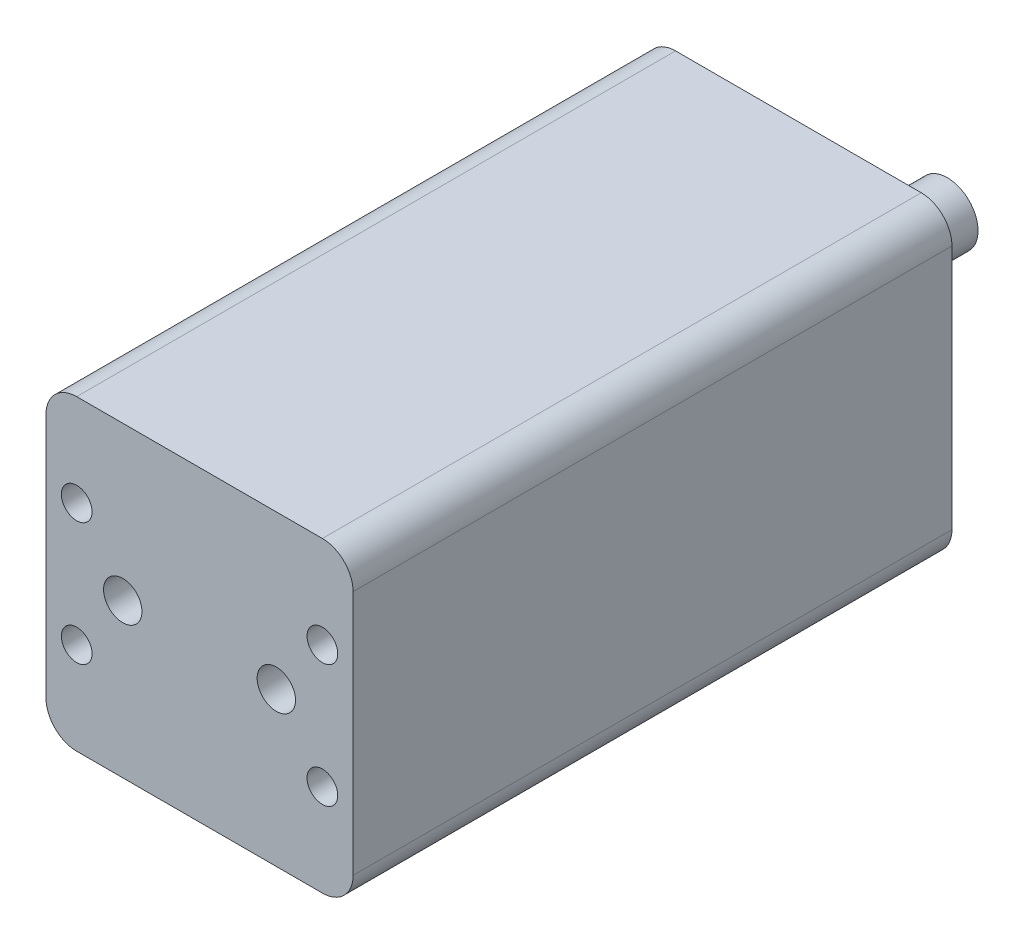
ISO-10303-21;
HEADER;
FILE_DESCRIPTION(('STEP AP214'),'2;1');
FILE_NAME('part.step','',(''),(''),'','','');
FILE_SCHEMA(('AUTOMOTIVE_DESIGN { 1 0 10303 214 1 1 1 1 }'));
ENDSEC;
DATA;
#1=APPLICATION_CONTEXT('core data for automotive mechanical design processes');
#2=APPLICATION_PROTOCOL_DEFINITION('international standard','automotive_design',2000,#1);
#3=PRODUCT_CONTEXT('',#1,'mechanical');
#4=PRODUCT('Part','Part','',(#3));
#5=PRODUCT_RELATED_PRODUCT_CATEGORY('part','',(#4));
#6=PRODUCT_DEFINITION_FORMATION('','',#4);
#7=PRODUCT_DEFINITION_CONTEXT('part definition',#1,'design');
#8=PRODUCT_DEFINITION('design','',#6,#7);
#9=PRODUCT_DEFINITION_SHAPE('','',#8);
#10=(LENGTH_UNIT() NAMED_UNIT(*) SI_UNIT(.MILLI.,.METRE.));
#11=(NAMED_UNIT(*) PLANE_ANGLE_UNIT() SI_UNIT($,.RADIAN.));
#12=(NAMED_UNIT(*) SI_UNIT($,.STERADIAN.) SOLID_ANGLE_UNIT());
#13=UNCERTAINTY_MEASURE_WITH_UNIT(LENGTH_MEASURE(1.E-05),#10,'distance_accuracy_value','');
#14=(GEOMETRIC_REPRESENTATION_CONTEXT(3) GLOBAL_UNCERTAINTY_ASSIGNED_CONTEXT((#13)) GLOBAL_UNIT_ASSIGNED_CONTEXT((#10,
#11,#12)) REPRESENTATION_CONTEXT('',''));
#15=CARTESIAN_POINT('',(0.,0.,0.));
#16=DIRECTION('',(0.,0.,1.));
#17=DIRECTION('',(1.,0.,0.));
#18=AXIS2_PLACEMENT_3D('',#15,#16,#17);
#19=CARTESIAN_POINT('',(-16.,-16.,78.));
#20=DIRECTION('',(0.,0.,-1.));
#21=DIRECTION('',(-1.,0.,0.));
#22=AXIS2_PLACEMENT_3D('',#19,#20,#21);
#23=CYLINDRICAL_SURFACE('',#22,4.);
#24=CARTESIAN_POINT('',(-16.,-16.,0.));
#25=DIRECTION('',(0.,0.,1.));
#26=DIRECTION('',(-1.,0.,0.));
#27=AXIS2_PLACEMENT_3D('',#24,#25,#26);
#28=CIRCLE('',#27,4.);
#29=CARTESIAN_POINT('',(-20.,-16.,0.));
#30=VERTEX_POINT('',#29);
#31=CARTESIAN_POINT('',(-16.,-20.,0.));
#32=VERTEX_POINT('',#31);
#33=EDGE_CURVE('E149',#30,#32,#28,.T.);
#34=ORIENTED_EDGE('',*,*,#33,.T.);
#35=DIRECTION('',(0.,0.,-1.));
#36=VECTOR('',#35,1.);
#37=CARTESIAN_POINT('',(-16.,-20.,78.));
#38=LINE('',#37,#36);
#39=CARTESIAN_POINT('',(-16.,-20.,78.));
#40=VERTEX_POINT('',#39);
#41=EDGE_CURVE('E48',#40,#32,#38,.T.);
#42=ORIENTED_EDGE('',*,*,#41,.F.);
#43=CARTESIAN_POINT('',(-16.,-16.,78.));
#44=DIRECTION('',(0.,0.,1.));
#45=DIRECTION('',(-1.,0.,0.));
#46=AXIS2_PLACEMENT_3D('',#43,#44,#45);
#47=CIRCLE('',#46,4.);
#48=CARTESIAN_POINT('',(-20.,-16.,78.));
#49=VERTEX_POINT('',#48);
#50=EDGE_CURVE('E172',#49,#40,#47,.T.);
#51=ORIENTED_EDGE('',*,*,#50,.F.);
#52=DIRECTION('',(0.,0.,-1.));
#53=VECTOR('',#52,1.);
#54=CARTESIAN_POINT('',(-20.,-16.,78.));
#55=LINE('',#54,#53);
#56=EDGE_CURVE('E145',#49,#30,#55,.T.);
#57=ORIENTED_EDGE('',*,*,#56,.T.);
#58=EDGE_LOOP('',(#34,#42,#51,#57));
#59=FACE_BOUND('',#58,.T.);
#60=ADVANCED_FACE('F45',(#59),#23,.T.);
#61=CARTESIAN_POINT('',(-16.,-20.,78.));
#62=DIRECTION('',(0.,1.,0.));
#63=DIRECTION('',(0.,0.,1.));
#64=AXIS2_PLACEMENT_3D('',#61,#62,#63);
#65=PLANE('',#64);
#66=DIRECTION('',(1.,0.,0.));
#67=VECTOR('',#66,1.);
#68=CARTESIAN_POINT('',(-16.,-20.,0.));
#69=LINE('',#68,#67);
#70=CARTESIAN_POINT('',(16.,-20.,0.));
#71=VERTEX_POINT('',#70);
#72=EDGE_CURVE('E153',#32,#71,#69,.T.);
#73=ORIENTED_EDGE('',*,*,#72,.T.);
#74=DIRECTION('',(0.,0.,-1.));
#75=VECTOR('',#74,1.);
#76=CARTESIAN_POINT('',(16.,-20.,78.));
#77=LINE('',#76,#75);
#78=CARTESIAN_POINT('',(16.,-20.,78.));
#79=VERTEX_POINT('',#78);
#80=EDGE_CURVE('E186',#79,#71,#77,.T.);
#81=ORIENTED_EDGE('',*,*,#80,.F.);
#82=DIRECTION('',(1.,0.,0.));
#83=VECTOR('',#82,1.);
#84=CARTESIAN_POINT('',(-16.,-20.,78.));
#85=LINE('',#84,#83);
#86=EDGE_CURVE('E108',#40,#79,#85,.T.);
#87=ORIENTED_EDGE('',*,*,#86,.F.);
#88=ORIENTED_EDGE('',*,*,#41,.T.);
#89=EDGE_LOOP('',(#73,#81,#87,#88));
#90=FACE_BOUND('',#89,.T.);
#91=ADVANCED_FACE('F341',(#90),#65,.F.);
#92=CARTESIAN_POINT('',(16.,-16.,78.));
#93=DIRECTION('',(0.,0.,-1.));
#94=DIRECTION('',(-1.,0.,0.));
#95=AXIS2_PLACEMENT_3D('',#92,#93,#94);
#96=CYLINDRICAL_SURFACE('',#95,4.);
#97=CARTESIAN_POINT('',(16.,-16.,0.));
#98=DIRECTION('',(0.,0.,1.));
#99=DIRECTION('',(1.,0.,0.));
#100=AXIS2_PLACEMENT_3D('',#97,#98,#99);
#101=CIRCLE('',#100,4.);
#102=CARTESIAN_POINT('',(20.,-16.,0.));
#103=VERTEX_POINT('',#102);
#104=EDGE_CURVE('E157',#71,#103,#101,.T.);
#105=ORIENTED_EDGE('',*,*,#104,.T.);
#106=DIRECTION('',(0.,0.,-1.));
#107=VECTOR('',#106,1.);
#108=CARTESIAN_POINT('',(20.,-16.,78.));
#109=LINE('',#108,#107);
#110=CARTESIAN_POINT('',(20.,-16.,78.));
#111=VERTEX_POINT('',#110);
#112=EDGE_CURVE('E183',#111,#103,#109,.T.);
#113=ORIENTED_EDGE('',*,*,#112,.F.);
#114=CARTESIAN_POINT('',(16.,-16.,78.));
#115=DIRECTION('',(0.,0.,1.));
#116=DIRECTION('',(1.,0.,0.));
#117=AXIS2_PLACEMENT_3D('',#114,#115,#116);
#118=CIRCLE('',#117,4.);
#119=EDGE_CURVE('E205',#79,#111,#118,.T.);
#120=ORIENTED_EDGE('',*,*,#119,.F.);
#121=ORIENTED_EDGE('',*,*,#80,.T.);
#122=EDGE_LOOP('',(#105,#113,#120,#121));
#123=FACE_BOUND('',#122,.T.);
#124=ADVANCED_FACE('F346',(#123),#96,.T.);
#125=CARTESIAN_POINT('',(20.,-16.,78.));
#126=DIRECTION('',(-1.,0.,0.));
#127=DIRECTION('',(0.,0.,1.));
#128=AXIS2_PLACEMENT_3D('',#125,#126,#127);
#129=PLANE('',#128);
#130=DIRECTION('',(0.,1.,0.));
#131=VECTOR('',#130,1.);
#132=CARTESIAN_POINT('',(20.,-16.,0.));
#133=LINE('',#132,#131);
#134=CARTESIAN_POINT('',(20.,16.,0.));
#135=VERTEX_POINT('',#134);
#136=EDGE_CURVE('E160',#103,#135,#133,.T.);
#137=ORIENTED_EDGE('',*,*,#136,.T.);
#138=DIRECTION('',(0.,0.,-1.));
#139=VECTOR('',#138,1.);
#140=CARTESIAN_POINT('',(20.,16.,78.));
#141=LINE('',#140,#139);
#142=CARTESIAN_POINT('',(20.,16.,78.));
#143=VERTEX_POINT('',#142);
#144=EDGE_CURVE('E179',#143,#135,#141,.T.);
#145=ORIENTED_EDGE('',*,*,#144,.F.);
#146=DIRECTION('',(0.,1.,0.));
#147=VECTOR('',#146,1.);
#148=CARTESIAN_POINT('',(20.,-16.,78.));
#149=LINE('',#148,#147);
#150=EDGE_CURVE('E208',#111,#143,#149,.T.);
#151=ORIENTED_EDGE('',*,*,#150,.F.);
#152=ORIENTED_EDGE('',*,*,#112,.T.);
#153=EDGE_LOOP('',(#137,#145,#151,#152));
#154=FACE_BOUND('',#153,.T.);
#155=ADVANCED_FACE('F355',(#154),#129,.F.);
#156=CARTESIAN_POINT('',(16.,16.,78.));
#157=DIRECTION('',(0.,0.,-1.));
#158=DIRECTION('',(-1.,0.,0.));
#159=AXIS2_PLACEMENT_3D('',#156,#157,#158);
#160=CYLINDRICAL_SURFACE('',#159,4.);
#161=CARTESIAN_POINT('',(16.,16.,0.));
#162=DIRECTION('',(0.,0.,1.));
#163=DIRECTION('',(-1.,0.,0.));
#164=AXIS2_PLACEMENT_3D('',#161,#162,#163);
#165=CIRCLE('',#164,4.);
#166=CARTESIAN_POINT('',(16.,20.,0.));
#167=VERTEX_POINT('',#166);
#168=EDGE_CURVE('E163',#135,#167,#165,.T.);
#169=ORIENTED_EDGE('',*,*,#168,.T.);
#170=DIRECTION('',(0.,0.,-1.));
#171=VECTOR('',#170,1.);
#172=CARTESIAN_POINT('',(16.,20.,78.));
#173=LINE('',#172,#171);
#174=CARTESIAN_POINT('',(16.,20.,78.));
#175=VERTEX_POINT('',#174);
#176=EDGE_CURVE('E138',#175,#167,#173,.T.);
#177=ORIENTED_EDGE('',*,*,#176,.F.);
#178=CARTESIAN_POINT('',(16.,16.,78.));
#179=DIRECTION('',(0.,0.,1.));
#180=DIRECTION('',(-1.,0.,0.));
#181=AXIS2_PLACEMENT_3D('',#178,#179,#180);
#182=CIRCLE('',#181,4.);
#183=EDGE_CURVE('E127',#143,#175,#182,.T.);
#184=ORIENTED_EDGE('',*,*,#183,.F.);
#185=ORIENTED_EDGE('',*,*,#144,.T.);
#186=EDGE_LOOP('',(#169,#177,#184,#185));
#187=FACE_BOUND('',#186,.T.);
#188=ADVANCED_FACE('F358',(#187),#160,.T.);
#189=CARTESIAN_POINT('',(-16.,20.,78.));
#190=DIRECTION('',(0.,-1.,0.));
#191=DIRECTION('',(0.,0.,-1.));
#192=AXIS2_PLACEMENT_3D('',#189,#190,#191);
#193=PLANE('',#192);
#194=DIRECTION('',(-1.,0.,0.));
#195=VECTOR('',#194,1.);
#196=CARTESIAN_POINT('',(-16.,20.,0.));
#197=LINE('',#196,#195);
#198=CARTESIAN_POINT('',(-16.,20.,0.));
#199=VERTEX_POINT('',#198);
#200=EDGE_CURVE('E136',#167,#199,#197,.T.);
#201=ORIENTED_EDGE('',*,*,#200,.T.);
#202=DIRECTION('',(0.,0.,-1.));
#203=VECTOR('',#202,1.);
#204=CARTESIAN_POINT('',(-16.,20.,78.));
#205=LINE('',#204,#203);
#206=CARTESIAN_POINT('',(-16.,20.,78.));
#207=VERTEX_POINT('',#206);
#208=EDGE_CURVE('E133',#207,#199,#205,.T.);
#209=ORIENTED_EDGE('',*,*,#208,.F.);
#210=DIRECTION('',(-1.,0.,0.));
#211=VECTOR('',#210,1.);
#212=CARTESIAN_POINT('',(-16.,20.,78.));
#213=LINE('',#212,#211);
#214=EDGE_CURVE('E121',#175,#207,#213,.T.);
#215=ORIENTED_EDGE('',*,*,#214,.F.);
#216=ORIENTED_EDGE('',*,*,#176,.T.);
#217=EDGE_LOOP('',(#201,#209,#215,#216));
#218=FACE_BOUND('',#217,.T.);
#219=ADVANCED_FACE('F134',(#218),#193,.F.);
#220=CARTESIAN_POINT('',(-16.,16.,78.));
#221=DIRECTION('',(0.,0.,-1.));
#222=DIRECTION('',(-1.,0.,0.));
#223=AXIS2_PLACEMENT_3D('',#220,#221,#222);
#224=CYLINDRICAL_SURFACE('',#223,4.);
#225=CARTESIAN_POINT('',(-16.,16.,0.));
#226=DIRECTION('',(0.,0.,1.));
#227=DIRECTION('',(-1.,0.,0.));
#228=AXIS2_PLACEMENT_3D('',#225,#226,#227);
#229=CIRCLE('',#228,4.);
#230=CARTESIAN_POINT('',(-20.,16.,0.));
#231=VERTEX_POINT('',#230);
#232=EDGE_CURVE('E93',#199,#231,#229,.T.);
#233=ORIENTED_EDGE('',*,*,#232,.T.);
#234=DIRECTION('',(0.,0.,-1.));
#235=VECTOR('',#234,1.);
#236=CARTESIAN_POINT('',(-20.,16.,78.));
#237=LINE('',#236,#235);
#238=CARTESIAN_POINT('',(-20.,16.,78.));
#239=VERTEX_POINT('',#238);
#240=EDGE_CURVE('E139',#239,#231,#237,.T.);
#241=ORIENTED_EDGE('',*,*,#240,.F.);
#242=CARTESIAN_POINT('',(-16.,16.,78.));
#243=DIRECTION('',(0.,0.,1.));
#244=DIRECTION('',(-1.,0.,0.));
#245=AXIS2_PLACEMENT_3D('',#242,#243,#244);
#246=CIRCLE('',#245,4.);
#247=EDGE_CURVE('E125',#207,#239,#246,.T.);
#248=ORIENTED_EDGE('',*,*,#247,.F.);
#249=ORIENTED_EDGE('',*,*,#208,.T.);
#250=EDGE_LOOP('',(#233,#241,#248,#249));
#251=FACE_BOUND('',#250,.T.);
#252=ADVANCED_FACE('F141',(#251),#224,.T.);
#253=CARTESIAN_POINT('',(-20.,-16.,78.));
#254=DIRECTION('',(1.,0.,0.));
#255=DIRECTION('',(0.,0.,-1.));
#256=AXIS2_PLACEMENT_3D('',#253,#254,#255);
#257=PLANE('',#256);
#258=DIRECTION('',(0.,-1.,0.));
#259=VECTOR('',#258,1.);
#260=CARTESIAN_POINT('',(-20.,-16.,0.));
#261=LINE('',#260,#259);
#262=EDGE_CURVE('E99',#231,#30,#261,.T.);
#263=ORIENTED_EDGE('',*,*,#262,.T.);
#264=ORIENTED_EDGE('',*,*,#56,.F.);
#265=DIRECTION('',(0.,-1.,0.));
#266=VECTOR('',#265,1.);
#267=CARTESIAN_POINT('',(-20.,-16.,78.));
#268=LINE('',#267,#266);
#269=EDGE_CURVE('E64',#239,#49,#268,.T.);
#270=ORIENTED_EDGE('',*,*,#269,.F.);
#271=ORIENTED_EDGE('',*,*,#240,.T.);
#272=EDGE_LOOP('',(#263,#264,#270,#271));
#273=FACE_BOUND('',#272,.T.);
#274=ADVANCED_FACE('F311',(#273),#257,.F.);
#275=CARTESIAN_POINT('',(-16.,-16.,78.));
#276=DIRECTION('',(0.,0.,-1.));
#277=DIRECTION('',(-1.,0.,0.));
#278=AXIS2_PLACEMENT_3D('',#275,#276,#277);
#279=PLANE('',#278);
#280=CARTESIAN_POINT('',(10.,0.,78.));
#281=DIRECTION('',(0.,0.,1.));
#282=DIRECTION('',(1.,0.,0.));
#283=AXIS2_PLACEMENT_3D('',#280,#281,#282);
#284=CIRCLE('',#283,2.5);
#285=CARTESIAN_POINT('',(12.5,0.,78.));
#286=VERTEX_POINT('',#285);
#287=EDGE_CURVE('E285',#286,#286,#284,.T.);
#288=ORIENTED_EDGE('',*,*,#287,.F.);
#289=EDGE_LOOP('',(#288));
#290=FACE_BOUND('',#289,.T.);
#291=CARTESIAN_POINT('',(-10.,0.,78.));
#292=DIRECTION('',(0.,0.,1.));
#293=DIRECTION('',(-1.,0.,0.));
#294=AXIS2_PLACEMENT_3D('',#291,#292,#293);
#295=CIRCLE('',#294,2.5);
#296=CARTESIAN_POINT('',(-12.5,0.,78.));
#297=VERTEX_POINT('',#296);
#298=EDGE_CURVE('E289',#297,#297,#295,.T.);
#299=ORIENTED_EDGE('',*,*,#298,.F.);
#300=EDGE_LOOP('',(#299));
#301=FACE_BOUND('',#300,.T.);
#302=CARTESIAN_POINT('',(16.,8.,78.));
#303=DIRECTION('',(0.,0.,1.));
#304=DIRECTION('',(-1.,0.,0.));
#305=AXIS2_PLACEMENT_3D('',#302,#303,#304);
#306=CIRCLE('',#305,2.);
#307=CARTESIAN_POINT('',(14.,8.,78.));
#308=VERTEX_POINT('',#307);
#309=EDGE_CURVE('E257',#308,#308,#306,.T.);
#310=ORIENTED_EDGE('',*,*,#309,.F.);
#311=EDGE_LOOP('',(#310));
#312=FACE_BOUND('',#311,.T.);
#313=CARTESIAN_POINT('',(-16.,-8.,78.));
#314=DIRECTION('',(0.,0.,1.));
#315=DIRECTION('',(-1.,0.,0.));
#316=AXIS2_PLACEMENT_3D('',#313,#314,#315);
#317=CIRCLE('',#316,2.);
#318=CARTESIAN_POINT('',(-18.,-8.,78.));
#319=VERTEX_POINT('',#318);
#320=EDGE_CURVE('E265',#319,#319,#317,.T.);
#321=ORIENTED_EDGE('',*,*,#320,.F.);
#322=EDGE_LOOP('',(#321));
#323=FACE_BOUND('',#322,.T.);
#324=CARTESIAN_POINT('',(16.,-7.99999999999999,78.));
#325=DIRECTION('',(0.,0.,1.));
#326=DIRECTION('',(1.,0.,0.));
#327=AXIS2_PLACEMENT_3D('',#324,#325,#326);
#328=CIRCLE('',#327,2.);
#329=CARTESIAN_POINT('',(18.,-7.99999999999999,78.));
#330=VERTEX_POINT('',#329);
#331=EDGE_CURVE('E273',#330,#330,#328,.T.);
#332=ORIENTED_EDGE('',*,*,#331,.F.);
#333=EDGE_LOOP('',(#332));
#334=FACE_BOUND('',#333,.T.);
#335=CARTESIAN_POINT('',(-16.,8.,78.));
#336=DIRECTION('',(0.,0.,1.));
#337=DIRECTION('',(1.,0.,0.));
#338=AXIS2_PLACEMENT_3D('',#335,#336,#337);
#339=CIRCLE('',#338,2.);
#340=CARTESIAN_POINT('',(-14.,8.,78.));
#341=VERTEX_POINT('',#340);
#342=EDGE_CURVE('E253',#341,#341,#339,.T.);
#343=ORIENTED_EDGE('',*,*,#342,.F.);
#344=EDGE_LOOP('',(#343));
#345=FACE_BOUND('',#344,.T.);
#346=ORIENTED_EDGE('',*,*,#50,.T.);
#347=ORIENTED_EDGE('',*,*,#86,.T.);
#348=ORIENTED_EDGE('',*,*,#119,.T.);
#349=ORIENTED_EDGE('',*,*,#150,.T.);
#350=ORIENTED_EDGE('',*,*,#183,.T.);
#351=ORIENTED_EDGE('',*,*,#214,.T.);
#352=ORIENTED_EDGE('',*,*,#247,.T.);
#353=ORIENTED_EDGE('',*,*,#269,.T.);
#354=EDGE_LOOP('',(#346,#347,#348,#349,#350,#351,#352,#353));
#355=FACE_BOUND('',#354,.T.);
#356=ADVANCED_FACE('F123',(#290,#301,#312,#323,#334,#345,#355),#279,.F.);
#357=CARTESIAN_POINT('',(-16.,-16.,0.));
#358=DIRECTION('',(0.,0.,-1.));
#359=DIRECTION('',(-1.,0.,0.));
#360=AXIS2_PLACEMENT_3D('',#357,#358,#359);
#361=PLANE('',#360);
#362=CARTESIAN_POINT('',(15.5000000000002,-15.4999999999998,0.));
#363=DIRECTION('',(0.,0.,-1.));
#364=DIRECTION('',(-1.,0.,0.));
#365=AXIS2_PLACEMENT_3D('',#362,#363,#364);
#366=CIRCLE('',#365,2.);
#367=CARTESIAN_POINT('',(13.5000000000002,-15.4999999999998,0.));
#368=VERTEX_POINT('',#367);
#369=EDGE_CURVE('E241',#368,#368,#366,.T.);
#370=ORIENTED_EDGE('',*,*,#369,.F.);
#371=EDGE_LOOP('',(#370));
#372=FACE_BOUND('',#371,.T.);
#373=CARTESIAN_POINT('',(-15.4999999999999,-15.5000000000001,0.));
#374=DIRECTION('',(0.,0.,-1.));
#375=DIRECTION('',(-1.,0.,0.));
#376=AXIS2_PLACEMENT_3D('',#373,#374,#375);
#377=CIRCLE('',#376,2.);
#378=CARTESIAN_POINT('',(-17.4999999999999,-15.5000000000001,0.));
#379=VERTEX_POINT('',#378);
#380=EDGE_CURVE('E233',#379,#379,#377,.T.);
#381=ORIENTED_EDGE('',*,*,#380,.F.);
#382=EDGE_LOOP('',(#381));
#383=FACE_BOUND('',#382,.T.);
#384=CARTESIAN_POINT('',(-15.5000000000001,15.4999999999999,0.));
#385=DIRECTION('',(0.,0.,-1.));
#386=DIRECTION('',(-1.,0.,0.));
#387=AXIS2_PLACEMENT_3D('',#384,#385,#386);
#388=CIRCLE('',#387,2.);
#389=CARTESIAN_POINT('',(-17.5000000000001,15.4999999999999,0.));
#390=VERTEX_POINT('',#389);
#391=EDGE_CURVE('E225',#390,#390,#388,.T.);
#392=ORIENTED_EDGE('',*,*,#391,.F.);
#393=EDGE_LOOP('',(#392));
#394=FACE_BOUND('',#393,.T.);
#395=CARTESIAN_POINT('',(15.5,15.5,0.));
#396=DIRECTION('',(0.,0.,-1.));
#397=DIRECTION('',(-1.,0.,0.));
#398=AXIS2_PLACEMENT_3D('',#395,#396,#397);
#399=CIRCLE('',#398,2.);
#400=CARTESIAN_POINT('',(13.5,15.5,0.));
#401=VERTEX_POINT('',#400);
#402=EDGE_CURVE('E221',#401,#401,#399,.T.);
#403=ORIENTED_EDGE('',*,*,#402,.F.);
#404=EDGE_LOOP('',(#403));
#405=FACE_BOUND('',#404,.T.);
#406=CARTESIAN_POINT('',(0.,0.,0.));
#407=DIRECTION('',(0.,0.,-1.));
#408=DIRECTION('',(-1.,0.,0.));
#409=AXIS2_PLACEMENT_3D('',#406,#407,#408);
#410=CIRCLE('',#409,16.);
#411=CARTESIAN_POINT('',(-16.,0.,0.));
#412=VERTEX_POINT('',#411);
#413=EDGE_CURVE('E55',#412,#412,#410,.T.);
#414=ORIENTED_EDGE('',*,*,#413,.F.);
#415=EDGE_LOOP('',(#414));
#416=FACE_BOUND('',#415,.T.);
#417=ORIENTED_EDGE('',*,*,#33,.F.);
#418=ORIENTED_EDGE('',*,*,#262,.F.);
#419=ORIENTED_EDGE('',*,*,#232,.F.);
#420=ORIENTED_EDGE('',*,*,#200,.F.);
#421=ORIENTED_EDGE('',*,*,#168,.F.);
#422=ORIENTED_EDGE('',*,*,#136,.F.);
#423=ORIENTED_EDGE('',*,*,#104,.F.);
#424=ORIENTED_EDGE('',*,*,#72,.F.);
#425=EDGE_LOOP('',(#417,#418,#419,#420,#421,#422,#423,#424));
#426=FACE_BOUND('',#425,.T.);
#427=ADVANCED_FACE('F310',(#372,#383,#394,#405,#416,#426),#361,.T.);
#428=CARTESIAN_POINT('',(0.,0.,-3.));
#429=DIRECTION('',(0.,0.,1.));
#430=DIRECTION('',(1.,0.,0.));
#431=AXIS2_PLACEMENT_3D('',#428,#429,#430);
#432=CYLINDRICAL_SURFACE('',#431,16.);
#433=CARTESIAN_POINT('',(0.,0.,-3.));
#434=DIRECTION('',(0.,0.,-1.));
#435=DIRECTION('',(-1.,0.,0.));
#436=AXIS2_PLACEMENT_3D('',#433,#434,#435);
#437=CIRCLE('',#436,16.);
#438=CARTESIAN_POINT('',(-16.,0.,-3.));
#439=VERTEX_POINT('',#438);
#440=EDGE_CURVE('E154',#439,#439,#437,.T.);
#441=ORIENTED_EDGE('',*,*,#440,.F.);
#442=EDGE_LOOP('',(#441));
#443=FACE_BOUND('',#442,.T.);
#444=ORIENTED_EDGE('',*,*,#413,.T.);
#445=EDGE_LOOP('',(#444));
#446=FACE_BOUND('',#445,.T.);
#447=ADVANCED_FACE('F422',(#443,#446),#432,.T.);
#448=CARTESIAN_POINT('',(0.,0.,-3.));
#449=DIRECTION('',(0.,0.,-1.));
#450=DIRECTION('',(-1.,0.,0.));
#451=AXIS2_PLACEMENT_3D('',#448,#449,#450);
#452=PLANE('',#451);
#453=CARTESIAN_POINT('',(0.,0.,-3.));
#454=DIRECTION('',(0.,0.,-1.));
#455=DIRECTION('',(-1.,0.,0.));
#456=AXIS2_PLACEMENT_3D('',#453,#454,#455);
#457=CIRCLE('',#456,4.);
#458=CARTESIAN_POINT('',(-4.,0.,-3.));
#459=VERTEX_POINT('',#458);
#460=EDGE_CURVE('E11',#459,#459,#457,.T.);
#461=ORIENTED_EDGE('',*,*,#460,.F.);
#462=EDGE_LOOP('',(#461));
#463=FACE_BOUND('',#462,.T.);
#464=ORIENTED_EDGE('',*,*,#440,.T.);
#465=EDGE_LOOP('',(#464));
#466=FACE_BOUND('',#465,.T.);
#467=ADVANCED_FACE('F433',(#463,#466),#452,.T.);
#468=CARTESIAN_POINT('',(0.,0.,-19.4));
#469=DIRECTION('',(0.,0.,1.));
#470=DIRECTION('',(1.,0.,0.));
#471=AXIS2_PLACEMENT_3D('',#468,#469,#470);
#472=CYLINDRICAL_SURFACE('',#471,4.);
#473=CARTESIAN_POINT('',(0.,0.,-19.4));
#474=DIRECTION('',(0.,0.,-1.));
#475=DIRECTION('',(-1.,0.,0.));
#476=AXIS2_PLACEMENT_3D('',#473,#474,#475);
#477=CIRCLE('',#476,4.);
#478=CARTESIAN_POINT('',(-4.,0.,-19.4));
#479=VERTEX_POINT('',#478);
#480=EDGE_CURVE('E214',#479,#479,#477,.T.);
#481=ORIENTED_EDGE('',*,*,#480,.F.);
#482=EDGE_LOOP('',(#481));
#483=FACE_BOUND('',#482,.T.);
#484=ORIENTED_EDGE('',*,*,#460,.T.);
#485=EDGE_LOOP('',(#484));
#486=FACE_BOUND('',#485,.T.);
#487=ADVANCED_FACE('F443',(#483,#486),#472,.T.);
#488=CARTESIAN_POINT('',(0.,0.,-19.4));
#489=DIRECTION('',(0.,0.,-1.));
#490=DIRECTION('',(-1.,0.,0.));
#491=AXIS2_PLACEMENT_3D('',#488,#489,#490);
#492=PLANE('',#491);
#493=ORIENTED_EDGE('',*,*,#480,.T.);
#494=EDGE_LOOP('',(#493));
#495=FACE_BOUND('',#494,.T.);
#496=ADVANCED_FACE('F453',(#495),#492,.T.);
#497=CARTESIAN_POINT('',(15.5,15.5,9.));
#498=DIRECTION('',(0.,0.,-1.));
#499=DIRECTION('',(-1.,0.,0.));
#500=AXIS2_PLACEMENT_3D('',#497,#498,#499);
#501=CYLINDRICAL_SURFACE('',#500,2.);
#502=CARTESIAN_POINT('',(15.5,15.5,9.));
#503=DIRECTION('',(0.,0.,-1.));
#504=DIRECTION('',(-1.,0.,0.));
#505=AXIS2_PLACEMENT_3D('',#502,#503,#504);
#506=CIRCLE('',#505,2.);
#507=CARTESIAN_POINT('',(13.5,15.5,9.));
#508=VERTEX_POINT('',#507);
#509=EDGE_CURVE('E217',#508,#508,#506,.T.);
#510=ORIENTED_EDGE('',*,*,#509,.F.);
#511=EDGE_LOOP('',(#510));
#512=FACE_BOUND('',#511,.T.);
#513=ORIENTED_EDGE('',*,*,#402,.T.);
#514=EDGE_LOOP('',(#513));
#515=FACE_BOUND('',#514,.T.);
#516=ADVANCED_FACE('F462',(#512,#515),#501,.F.);
#517=CARTESIAN_POINT('',(15.5,15.5,9.));
#518=DIRECTION('',(0.,0.,-1.));
#519=DIRECTION('',(-1.,0.,0.));
#520=AXIS2_PLACEMENT_3D('',#517,#518,#519);
#521=PLANE('',#520);
#522=ORIENTED_EDGE('',*,*,#509,.T.);
#523=EDGE_LOOP('',(#522));
#524=FACE_BOUND('',#523,.T.);
#525=ADVANCED_FACE('F471',(#524),#521,.T.);
#526=CARTESIAN_POINT('',(-15.5000000000001,15.4999999999999,9.));
#527=DIRECTION('',(0.,0.,-1.));
#528=DIRECTION('',(-1.,0.,0.));
#529=AXIS2_PLACEMENT_3D('',#526,#527,#528);
#530=CYLINDRICAL_SURFACE('',#529,2.);
#531=CARTESIAN_POINT('',(-15.5000000000001,15.4999999999999,9.));
#532=DIRECTION('',(0.,0.,-1.));
#533=DIRECTION('',(-1.,0.,0.));
#534=AXIS2_PLACEMENT_3D('',#531,#532,#533);
#535=CIRCLE('',#534,2.);
#536=CARTESIAN_POINT('',(-17.5000000000001,15.4999999999999,9.));
#537=VERTEX_POINT('',#536);
#538=EDGE_CURVE('E229',#537,#537,#535,.T.);
#539=ORIENTED_EDGE('',*,*,#538,.F.);
#540=EDGE_LOOP('',(#539));
#541=FACE_BOUND('',#540,.T.);
#542=ORIENTED_EDGE('',*,*,#391,.T.);
#543=EDGE_LOOP('',(#542));
#544=FACE_BOUND('',#543,.T.);
#545=ADVANCED_FACE('F481',(#541,#544),#530,.F.);
#546=CARTESIAN_POINT('',(-15.5000000000001,15.4999999999999,9.));
#547=DIRECTION('',(0.,0.,-1.));
#548=DIRECTION('',(-1.,0.,0.));
#549=AXIS2_PLACEMENT_3D('',#546,#547,#548);
#550=PLANE('',#549);
#551=ORIENTED_EDGE('',*,*,#538,.T.);
#552=EDGE_LOOP('',(#551));
#553=FACE_BOUND('',#552,.T.);
#554=ADVANCED_FACE('F491',(#553),#550,.T.);
#555=CARTESIAN_POINT('',(-15.4999999999999,-15.5000000000001,9.));
#556=DIRECTION('',(0.,0.,-1.));
#557=DIRECTION('',(-1.,0.,0.));
#558=AXIS2_PLACEMENT_3D('',#555,#556,#557);
#559=CYLINDRICAL_SURFACE('',#558,2.);
#560=CARTESIAN_POINT('',(-15.4999999999999,-15.5000000000001,9.));
#561=DIRECTION('',(0.,0.,-1.));
#562=DIRECTION('',(-1.,0.,0.));
#563=AXIS2_PLACEMENT_3D('',#560,#561,#562);
#564=CIRCLE('',#563,2.);
#565=CARTESIAN_POINT('',(-17.4999999999999,-15.5000000000001,9.));
#566=VERTEX_POINT('',#565);
#567=EDGE_CURVE('E237',#566,#566,#564,.T.);
#568=ORIENTED_EDGE('',*,*,#567,.F.);
#569=EDGE_LOOP('',(#568));
#570=FACE_BOUND('',#569,.T.);
#571=ORIENTED_EDGE('',*,*,#380,.T.);
#572=EDGE_LOOP('',(#571));
#573=FACE_BOUND('',#572,.T.);
#574=ADVANCED_FACE('F500',(#570,#573),#559,.F.);
#575=CARTESIAN_POINT('',(-15.4999999999999,-15.5000000000001,9.));
#576=DIRECTION('',(0.,0.,-1.));
#577=DIRECTION('',(-1.,0.,0.));
#578=AXIS2_PLACEMENT_3D('',#575,#576,#577);
#579=PLANE('',#578);
#580=ORIENTED_EDGE('',*,*,#567,.T.);
#581=EDGE_LOOP('',(#580));
#582=FACE_BOUND('',#581,.T.);
#583=ADVANCED_FACE('F510',(#582),#579,.T.);
#584=CARTESIAN_POINT('',(15.5000000000002,-15.4999999999998,9.));
#585=DIRECTION('',(0.,0.,-1.));
#586=DIRECTION('',(-1.,0.,0.));
#587=AXIS2_PLACEMENT_3D('',#584,#585,#586);
#588=CYLINDRICAL_SURFACE('',#587,2.);
#589=CARTESIAN_POINT('',(15.5000000000002,-15.4999999999998,9.));
#590=DIRECTION('',(0.,0.,-1.));
#591=DIRECTION('',(-1.,0.,0.));
#592=AXIS2_PLACEMENT_3D('',#589,#590,#591);
#593=CIRCLE('',#592,2.);
#594=CARTESIAN_POINT('',(13.5000000000002,-15.4999999999998,9.));
#595=VERTEX_POINT('',#594);
#596=EDGE_CURVE('E245',#595,#595,#593,.T.);
#597=ORIENTED_EDGE('',*,*,#596,.F.);
#598=EDGE_LOOP('',(#597));
#599=FACE_BOUND('',#598,.T.);
#600=ORIENTED_EDGE('',*,*,#369,.T.);
#601=EDGE_LOOP('',(#600));
#602=FACE_BOUND('',#601,.T.);
#603=ADVANCED_FACE('F335',(#599,#602),#588,.F.);
#604=CARTESIAN_POINT('',(15.5000000000002,-15.4999999999998,9.));
#605=DIRECTION('',(0.,0.,-1.));
#606=DIRECTION('',(-1.,0.,0.));
#607=AXIS2_PLACEMENT_3D('',#604,#605,#606);
#608=PLANE('',#607);
#609=ORIENTED_EDGE('',*,*,#596,.T.);
#610=EDGE_LOOP('',(#609));
#611=FACE_BOUND('',#610,.T.);
#612=ADVANCED_FACE('F325',(#611),#608,.T.);
#613=CARTESIAN_POINT('',(-16.,8.,68.));
#614=DIRECTION('',(0.,0.,1.));
#615=DIRECTION('',(1.,0.,0.));
#616=AXIS2_PLACEMENT_3D('',#613,#614,#615);
#617=CYLINDRICAL_SURFACE('',#616,2.);
#618=CARTESIAN_POINT('',(-16.,8.,68.));
#619=DIRECTION('',(0.,0.,1.));
#620=DIRECTION('',(1.,0.,0.));
#621=AXIS2_PLACEMENT_3D('',#618,#619,#620);
#622=CIRCLE('',#621,2.);
#623=CARTESIAN_POINT('',(-14.,8.,68.));
#624=VERTEX_POINT('',#623);
#625=EDGE_CURVE('E249',#624,#624,#622,.T.);
#626=ORIENTED_EDGE('',*,*,#625,.F.);
#627=EDGE_LOOP('',(#626));
#628=FACE_BOUND('',#627,.T.);
#629=ORIENTED_EDGE('',*,*,#342,.T.);
#630=EDGE_LOOP('',(#629));
#631=FACE_BOUND('',#630,.T.);
#632=ADVANCED_FACE('F322',(#628,#631),#617,.F.);
#633=CARTESIAN_POINT('',(-16.,8.,68.));
#634=DIRECTION('',(0.,0.,1.));
#635=DIRECTION('',(1.,0.,0.));
#636=AXIS2_PLACEMENT_3D('',#633,#634,#635);
#637=PLANE('',#636);
#638=ORIENTED_EDGE('',*,*,#625,.T.);
#639=EDGE_LOOP('',(#638));
#640=FACE_BOUND('',#639,.T.);
#641=ADVANCED_FACE('F324',(#640),#637,.T.);
#642=CARTESIAN_POINT('',(16.,-7.99999999999999,68.));
#643=DIRECTION('',(0.,0.,1.));
#644=DIRECTION('',(1.,0.,0.));
#645=AXIS2_PLACEMENT_3D('',#642,#643,#644);
#646=CYLINDRICAL_SURFACE('',#645,2.);
#647=CARTESIAN_POINT('',(16.,-7.99999999999999,68.));
#648=DIRECTION('',(0.,0.,1.));
#649=DIRECTION('',(1.,0.,0.));
#650=AXIS2_PLACEMENT_3D('',#647,#648,#649);
#651=CIRCLE('',#650,2.);
#652=CARTESIAN_POINT('',(18.,-7.99999999999999,68.));
#653=VERTEX_POINT('',#652);
#654=EDGE_CURVE('E277',#653,#653,#651,.T.);
#655=ORIENTED_EDGE('',*,*,#654,.F.);
#656=EDGE_LOOP('',(#655));
#657=FACE_BOUND('',#656,.T.);
#658=ORIENTED_EDGE('',*,*,#331,.T.);
#659=EDGE_LOOP('',(#658));
#660=FACE_BOUND('',#659,.T.);
#661=ADVANCED_FACE('F332',(#657,#660),#646,.F.);
#662=CARTESIAN_POINT('',(16.,-7.99999999999999,68.));
#663=DIRECTION('',(0.,0.,1.));
#664=DIRECTION('',(1.,0.,0.));
#665=AXIS2_PLACEMENT_3D('',#662,#663,#664);
#666=PLANE('',#665);
#667=ORIENTED_EDGE('',*,*,#654,.T.);
#668=EDGE_LOOP('',(#667));
#669=FACE_BOUND('',#668,.T.);
#670=ADVANCED_FACE('F554',(#669),#666,.T.);
#671=CARTESIAN_POINT('',(-16.,-8.,68.));
#672=DIRECTION('',(0.,0.,1.));
#673=DIRECTION('',(1.,0.,0.));
#674=AXIS2_PLACEMENT_3D('',#671,#672,#673);
#675=CYLINDRICAL_SURFACE('',#674,2.);
#676=CARTESIAN_POINT('',(-16.,-8.,68.));
#677=DIRECTION('',(0.,0.,1.));
#678=DIRECTION('',(-1.,0.,0.));
#679=AXIS2_PLACEMENT_3D('',#676,#677,#678);
#680=CIRCLE('',#679,2.);
#681=CARTESIAN_POINT('',(-18.,-8.,68.));
#682=VERTEX_POINT('',#681);
#683=EDGE_CURVE('E269',#682,#682,#680,.T.);
#684=ORIENTED_EDGE('',*,*,#683,.F.);
#685=EDGE_LOOP('',(#684));
#686=FACE_BOUND('',#685,.T.);
#687=ORIENTED_EDGE('',*,*,#320,.T.);
#688=EDGE_LOOP('',(#687));
#689=FACE_BOUND('',#688,.T.);
#690=ADVANCED_FACE('F564',(#686,#689),#675,.F.);
#691=CARTESIAN_POINT('',(-16.,-8.,68.));
#692=DIRECTION('',(0.,0.,-1.));
#693=DIRECTION('',(-1.,0.,0.));
#694=AXIS2_PLACEMENT_3D('',#691,#692,#693);
#695=PLANE('',#694);
#696=ORIENTED_EDGE('',*,*,#683,.T.);
#697=EDGE_LOOP('',(#696));
#698=FACE_BOUND('',#697,.T.);
#699=ADVANCED_FACE('F574',(#698),#695,.F.);
#700=CARTESIAN_POINT('',(16.,8.,68.));
#701=DIRECTION('',(0.,0.,1.));
#702=DIRECTION('',(1.,0.,0.));
#703=AXIS2_PLACEMENT_3D('',#700,#701,#702);
#704=CYLINDRICAL_SURFACE('',#703,2.);
#705=CARTESIAN_POINT('',(16.,8.,68.));
#706=DIRECTION('',(0.,0.,1.));
#707=DIRECTION('',(-1.,0.,0.));
#708=AXIS2_PLACEMENT_3D('',#705,#706,#707);
#709=CIRCLE('',#708,2.);
#710=CARTESIAN_POINT('',(14.,8.,68.));
#711=VERTEX_POINT('',#710);
#712=EDGE_CURVE('E261',#711,#711,#709,.T.);
#713=ORIENTED_EDGE('',*,*,#712,.F.);
#714=EDGE_LOOP('',(#713));
#715=FACE_BOUND('',#714,.T.);
#716=ORIENTED_EDGE('',*,*,#309,.T.);
#717=EDGE_LOOP('',(#716));
#718=FACE_BOUND('',#717,.T.);
#719=ADVANCED_FACE('F584',(#715,#718),#704,.F.);
#720=CARTESIAN_POINT('',(16.,8.,68.));
#721=DIRECTION('',(0.,0.,-1.));
#722=DIRECTION('',(-1.,0.,0.));
#723=AXIS2_PLACEMENT_3D('',#720,#721,#722);
#724=PLANE('',#723);
#725=ORIENTED_EDGE('',*,*,#712,.T.);
#726=EDGE_LOOP('',(#725));
#727=FACE_BOUND('',#726,.T.);
#728=ADVANCED_FACE('F304',(#727),#724,.F.);
#729=CARTESIAN_POINT('',(-10.,0.,68.));
#730=DIRECTION('',(0.,0.,1.));
#731=DIRECTION('',(1.,0.,0.));
#732=AXIS2_PLACEMENT_3D('',#729,#730,#731);
#733=CYLINDRICAL_SURFACE('',#732,2.5);
#734=CARTESIAN_POINT('',(-10.,0.,68.));
#735=DIRECTION('',(0.,0.,1.));
#736=DIRECTION('',(-1.,0.,0.));
#737=AXIS2_PLACEMENT_3D('',#734,#735,#736);
#738=CIRCLE('',#737,2.5);
#739=CARTESIAN_POINT('',(-12.5,0.,68.));
#740=VERTEX_POINT('',#739);
#741=EDGE_CURVE('E293',#740,#740,#738,.T.);
#742=ORIENTED_EDGE('',*,*,#741,.F.);
#743=EDGE_LOOP('',(#742));
#744=FACE_BOUND('',#743,.T.);
#745=ORIENTED_EDGE('',*,*,#298,.T.);
#746=EDGE_LOOP('',(#745));
#747=FACE_BOUND('',#746,.T.);
#748=ADVANCED_FACE('F301',(#744,#747),#733,.F.);
#749=CARTESIAN_POINT('',(-10.,0.,68.));
#750=DIRECTION('',(0.,0.,-1.));
#751=DIRECTION('',(-1.,0.,0.));
#752=AXIS2_PLACEMENT_3D('',#749,#750,#751);
#753=PLANE('',#752);
#754=ORIENTED_EDGE('',*,*,#741,.T.);
#755=EDGE_LOOP('',(#754));
#756=FACE_BOUND('',#755,.T.);
#757=ADVANCED_FACE('F299',(#756),#753,.F.);
#758=CARTESIAN_POINT('',(10.,0.,68.));
#759=DIRECTION('',(0.,0.,1.));
#760=DIRECTION('',(1.,0.,0.));
#761=AXIS2_PLACEMENT_3D('',#758,#759,#760);
#762=CYLINDRICAL_SURFACE('',#761,2.5);
#763=CARTESIAN_POINT('',(10.,0.,68.));
#764=DIRECTION('',(0.,0.,1.));
#765=DIRECTION('',(1.,0.,0.));
#766=AXIS2_PLACEMENT_3D('',#763,#764,#765);
#767=CIRCLE('',#766,2.5);
#768=CARTESIAN_POINT('',(12.5,0.,68.));
#769=VERTEX_POINT('',#768);
#770=EDGE_CURVE('E281',#769,#769,#767,.T.);
#771=ORIENTED_EDGE('',*,*,#770,.F.);
#772=EDGE_LOOP('',(#771));
#773=FACE_BOUND('',#772,.T.);
#774=ORIENTED_EDGE('',*,*,#287,.T.);
#775=EDGE_LOOP('',(#774));
#776=FACE_BOUND('',#775,.T.);
#777=ADVANCED_FACE('F617',(#773,#776),#762,.F.);
#778=CARTESIAN_POINT('',(10.,0.,68.));
#779=DIRECTION('',(0.,0.,1.));
#780=DIRECTION('',(1.,0.,0.));
#781=AXIS2_PLACEMENT_3D('',#778,#779,#780);
#782=PLANE('',#781);
#783=ORIENTED_EDGE('',*,*,#770,.T.);
#784=EDGE_LOOP('',(#783));
#785=FACE_BOUND('',#784,.T.);
#786=ADVANCED_FACE('F626',(#785),#782,.T.);
#787=CLOSED_SHELL('',(#60,#91,#124,#155,#188,#219,#252,#274,#356,#427,#447,#467,#487,#496,#516,
#525,#545,#554,#574,#583,#603,#612,#632,#641,#661,#670,#690,#699,#719,#728,#748,#757,#777,#786));
#788=MANIFOLD_SOLID_BREP('B2',#787);
#789=ADVANCED_BREP_SHAPE_REPRESENTATION('',(#18,#788),#14);
#790=SHAPE_DEFINITION_REPRESENTATION(#9,#789);
ENDSEC;
END-ISO-10303-21;
